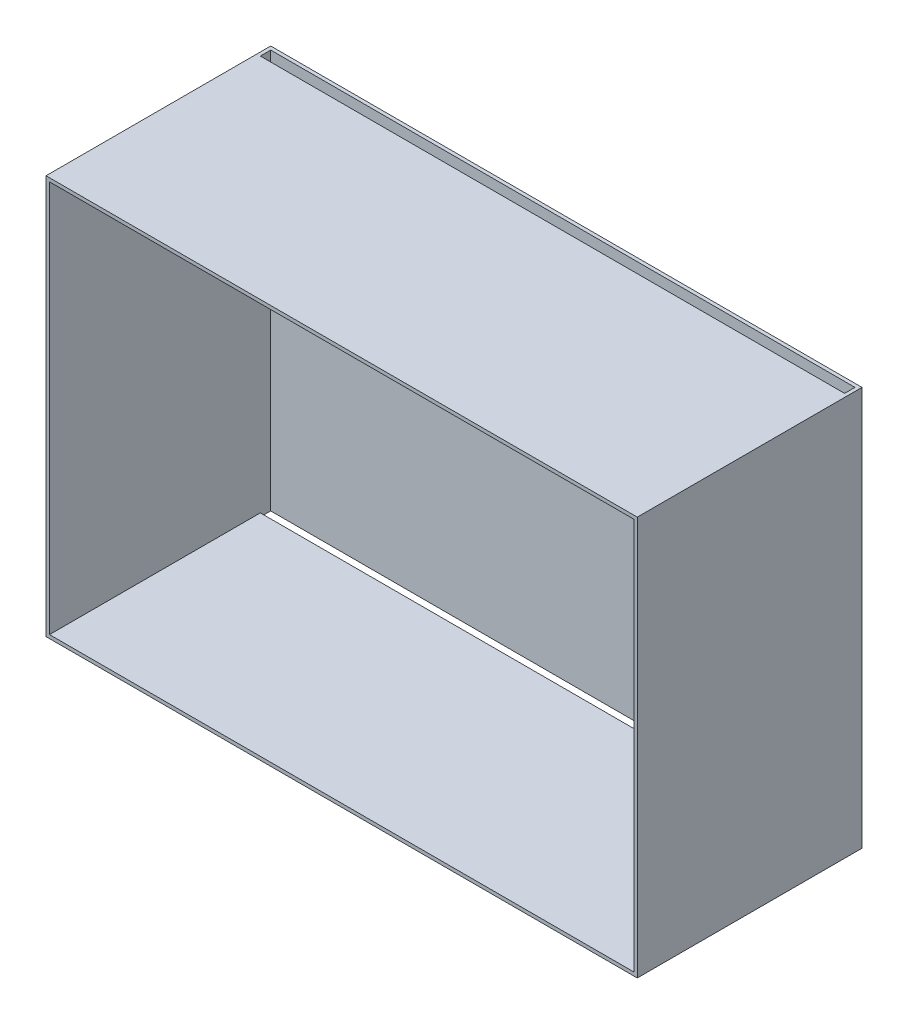
ISO-10303-21;
HEADER;
FILE_DESCRIPTION(('STEP AP214'),'2;1');
FILE_NAME('part.step','',(''),(''),'','','');
FILE_SCHEMA(('AUTOMOTIVE_DESIGN { 1 0 10303 214 1 1 1 1 }'));
ENDSEC;
DATA;
#1=APPLICATION_CONTEXT('core data for automotive mechanical design processes');
#2=APPLICATION_PROTOCOL_DEFINITION('international standard','automotive_design',2000,#1);
#3=PRODUCT_CONTEXT('',#1,'mechanical');
#4=PRODUCT('Part','Part','',(#3));
#5=PRODUCT_RELATED_PRODUCT_CATEGORY('part','',(#4));
#6=PRODUCT_DEFINITION_FORMATION('','',#4);
#7=PRODUCT_DEFINITION_CONTEXT('part definition',#1,'design');
#8=PRODUCT_DEFINITION('design','',#6,#7);
#9=PRODUCT_DEFINITION_SHAPE('','',#8);
#10=(LENGTH_UNIT() NAMED_UNIT(*) SI_UNIT(.MILLI.,.METRE.));
#11=(NAMED_UNIT(*) PLANE_ANGLE_UNIT() SI_UNIT($,.RADIAN.));
#12=(NAMED_UNIT(*) SI_UNIT($,.STERADIAN.) SOLID_ANGLE_UNIT());
#13=UNCERTAINTY_MEASURE_WITH_UNIT(LENGTH_MEASURE(1.E-05),#10,'distance_accuracy_value','');
#14=(GEOMETRIC_REPRESENTATION_CONTEXT(3) GLOBAL_UNCERTAINTY_ASSIGNED_CONTEXT((#13)) GLOBAL_UNIT_ASSIGNED_CONTEXT((#10,
#11,#12)) REPRESENTATION_CONTEXT('',''));
#15=CARTESIAN_POINT('',(0.,0.,0.));
#16=DIRECTION('',(0.,0.,1.));
#17=DIRECTION('',(1.,0.,0.));
#18=AXIS2_PLACEMENT_3D('',#15,#16,#17);
#19=CARTESIAN_POINT('',(0.,-180.467,203.2));
#20=DIRECTION('',(0.,1.,0.));
#21=DIRECTION('',(-1.,0.,0.));
#22=AXIS2_PLACEMENT_3D('',#19,#20,#21);
#23=PLANE('',#22);
#24=DIRECTION('',(1.,0.,0.));
#25=VECTOR('',#24,1.);
#26=CARTESIAN_POINT('',(0.,-180.467,0.));
#27=LINE('',#26,#25);
#28=CARTESIAN_POINT('',(-267.335,-180.467,0.));
#29=VERTEX_POINT('',#28);
#30=CARTESIAN_POINT('',(267.335,-180.467,0.));
#31=VERTEX_POINT('',#30);
#32=EDGE_CURVE('E315',#29,#31,#27,.T.);
#33=ORIENTED_EDGE('',*,*,#32,.T.);
#34=DIRECTION('',(0.,0.,-1.));
#35=VECTOR('',#34,1.);
#36=CARTESIAN_POINT('',(267.335,-180.467,203.2));
#37=LINE('',#36,#35);
#38=CARTESIAN_POINT('',(267.335,-180.467,203.2));
#39=VERTEX_POINT('',#38);
#40=EDGE_CURVE('E324',#39,#31,#37,.T.);
#41=ORIENTED_EDGE('',*,*,#40,.F.);
#42=DIRECTION('',(1.,0.,0.));
#43=VECTOR('',#42,1.);
#44=CARTESIAN_POINT('',(0.,-180.467,203.2));
#45=LINE('',#44,#43);
#46=CARTESIAN_POINT('',(-267.335,-180.467,203.2));
#47=VERTEX_POINT('',#46);
#48=EDGE_CURVE('E301',#47,#39,#45,.T.);
#49=ORIENTED_EDGE('',*,*,#48,.F.);
#50=DIRECTION('',(0.,0.,-1.));
#51=VECTOR('',#50,1.);
#52=CARTESIAN_POINT('',(-267.335,-180.467,203.2));
#53=LINE('',#52,#51);
#54=EDGE_CURVE('E327',#47,#29,#53,.T.);
#55=ORIENTED_EDGE('',*,*,#54,.T.);
#56=EDGE_LOOP('',(#33,#41,#49,#55));
#57=FACE_BOUND('',#56,.T.);
#58=DIRECTION('',(0.,0.,-1.));
#59=VECTOR('',#58,1.);
#60=CARTESIAN_POINT('',(264.16,-180.467,0.));
#61=LINE('',#60,#59);
#62=CARTESIAN_POINT('',(264.16,-180.467,12.573));
#63=VERTEX_POINT('',#62);
#64=CARTESIAN_POINT('',(264.16,-180.467,3.175));
#65=VERTEX_POINT('',#64);
#66=EDGE_CURVE('E133',#63,#65,#61,.T.);
#67=ORIENTED_EDGE('',*,*,#66,.T.);
#68=DIRECTION('',(1.,0.,0.));
#69=VECTOR('',#68,1.);
#70=CARTESIAN_POINT('',(0.,-180.467,3.175));
#71=LINE('',#70,#69);
#72=CARTESIAN_POINT('',(-264.16,-180.467,3.175));
#73=VERTEX_POINT('',#72);
#74=EDGE_CURVE('E231',#73,#65,#71,.T.);
#75=ORIENTED_EDGE('',*,*,#74,.F.);
#76=DIRECTION('',(0.,0.,-1.));
#77=VECTOR('',#76,1.);
#78=CARTESIAN_POINT('',(-264.16,-180.467,0.));
#79=LINE('',#78,#77);
#80=CARTESIAN_POINT('',(-264.16,-180.467,12.573));
#81=VERTEX_POINT('',#80);
#82=EDGE_CURVE('E235',#81,#73,#79,.T.);
#83=ORIENTED_EDGE('',*,*,#82,.F.);
#84=DIRECTION('',(1.,0.,0.));
#85=VECTOR('',#84,1.);
#86=CARTESIAN_POINT('',(0.,-180.467,12.573));
#87=LINE('',#86,#85);
#88=EDGE_CURVE('E244',#81,#63,#87,.T.);
#89=ORIENTED_EDGE('',*,*,#88,.T.);
#90=EDGE_LOOP('',(#67,#75,#83,#89));
#91=FACE_BOUND('',#90,.T.);
#92=ADVANCED_FACE('F117',(#57,#91),#23,.F.);
#93=CARTESIAN_POINT('',(0.,180.467,203.2));
#94=DIRECTION('',(0.,1.,0.));
#95=DIRECTION('',(0.,0.,1.));
#96=AXIS2_PLACEMENT_3D('',#93,#94,#95);
#97=PLANE('',#96);
#98=DIRECTION('',(1.,0.,0.));
#99=VECTOR('',#98,1.);
#100=CARTESIAN_POINT('',(0.,180.467,0.));
#101=LINE('',#100,#99);
#102=CARTESIAN_POINT('',(-267.335,180.467,0.));
#103=VERTEX_POINT('',#102);
#104=CARTESIAN_POINT('',(267.335,180.467,0.));
#105=VERTEX_POINT('',#104);
#106=EDGE_CURVE('E273',#103,#105,#101,.T.);
#107=ORIENTED_EDGE('',*,*,#106,.F.);
#108=DIRECTION('',(0.,0.,-1.));
#109=VECTOR('',#108,1.);
#110=CARTESIAN_POINT('',(-267.335,180.467,203.2));
#111=LINE('',#110,#109);
#112=CARTESIAN_POINT('',(-267.335,180.467,203.2));
#113=VERTEX_POINT('',#112);
#114=EDGE_CURVE('E126',#113,#103,#111,.T.);
#115=ORIENTED_EDGE('',*,*,#114,.F.);
#116=DIRECTION('',(1.,0.,0.));
#117=VECTOR('',#116,1.);
#118=CARTESIAN_POINT('',(0.,180.467,203.2));
#119=LINE('',#118,#117);
#120=CARTESIAN_POINT('',(267.335,180.467,203.2));
#121=VERTEX_POINT('',#120);
#122=EDGE_CURVE('E293',#113,#121,#119,.T.);
#123=ORIENTED_EDGE('',*,*,#122,.T.);
#124=DIRECTION('',(0.,0.,-1.));
#125=VECTOR('',#124,1.);
#126=CARTESIAN_POINT('',(267.335,180.467,203.2));
#127=LINE('',#126,#125);
#128=EDGE_CURVE('E308',#121,#105,#127,.T.);
#129=ORIENTED_EDGE('',*,*,#128,.T.);
#130=EDGE_LOOP('',(#107,#115,#123,#129));
#131=FACE_BOUND('',#130,.T.);
#132=DIRECTION('',(1.,0.,0.));
#133=VECTOR('',#132,1.);
#134=CARTESIAN_POINT('',(0.,180.467,3.175));
#135=LINE('',#134,#133);
#136=CARTESIAN_POINT('',(-264.16,180.467,3.175));
#137=VERTEX_POINT('',#136);
#138=CARTESIAN_POINT('',(264.16,180.467,3.175));
#139=VERTEX_POINT('',#138);
#140=EDGE_CURVE('E229',#137,#139,#135,.T.);
#141=ORIENTED_EDGE('',*,*,#140,.T.);
#142=DIRECTION('',(0.,0.,-1.));
#143=VECTOR('',#142,1.);
#144=CARTESIAN_POINT('',(264.16,180.467,0.));
#145=LINE('',#144,#143);
#146=CARTESIAN_POINT('',(264.16,180.467,12.573));
#147=VERTEX_POINT('',#146);
#148=EDGE_CURVE('E216',#147,#139,#145,.T.);
#149=ORIENTED_EDGE('',*,*,#148,.F.);
#150=DIRECTION('',(1.,0.,0.));
#151=VECTOR('',#150,1.);
#152=CARTESIAN_POINT('',(0.,180.467,12.573));
#153=LINE('',#152,#151);
#154=CARTESIAN_POINT('',(-264.16,180.467,12.573));
#155=VERTEX_POINT('',#154);
#156=EDGE_CURVE('E207',#155,#147,#153,.T.);
#157=ORIENTED_EDGE('',*,*,#156,.F.);
#158=DIRECTION('',(0.,0.,-1.));
#159=VECTOR('',#158,1.);
#160=CARTESIAN_POINT('',(-264.16,180.467,0.));
#161=LINE('',#160,#159);
#162=EDGE_CURVE('E141',#155,#137,#161,.T.);
#163=ORIENTED_EDGE('',*,*,#162,.T.);
#164=EDGE_LOOP('',(#141,#149,#157,#163));
#165=FACE_BOUND('',#164,.T.);
#166=ADVANCED_FACE('F119',(#131,#165),#97,.T.);
#167=CARTESIAN_POINT('',(0.,-177.292,203.2));
#168=DIRECTION('',(0.,1.,0.));
#169=DIRECTION('',(-1.,0.,0.));
#170=AXIS2_PLACEMENT_3D('',#167,#168,#169);
#171=PLANE('',#170);
#172=DIRECTION('',(0.,0.,-1.));
#173=VECTOR('',#172,1.);
#174=CARTESIAN_POINT('',(264.16,-177.292,203.2));
#175=LINE('',#174,#173);
#176=CARTESIAN_POINT('',(264.16,-177.292,203.2));
#177=VERTEX_POINT('',#176);
#178=CARTESIAN_POINT('',(264.16,-177.292,12.573));
#179=VERTEX_POINT('',#178);
#180=EDGE_CURVE('E269',#177,#179,#175,.T.);
#181=ORIENTED_EDGE('',*,*,#180,.T.);
#182=DIRECTION('',(-1.,0.,0.));
#183=VECTOR('',#182,1.);
#184=CARTESIAN_POINT('',(0.,-177.292,12.573));
#185=LINE('',#184,#183);
#186=CARTESIAN_POINT('',(-264.16,-177.292,12.573));
#187=VERTEX_POINT('',#186);
#188=EDGE_CURVE('E252',#179,#187,#185,.T.);
#189=ORIENTED_EDGE('',*,*,#188,.T.);
#190=DIRECTION('',(0.,0.,-1.));
#191=VECTOR('',#190,1.);
#192=CARTESIAN_POINT('',(-264.16,-177.292,203.2));
#193=LINE('',#192,#191);
#194=CARTESIAN_POINT('',(-264.16,-177.292,203.2));
#195=VERTEX_POINT('',#194);
#196=EDGE_CURVE('E264',#195,#187,#193,.T.);
#197=ORIENTED_EDGE('',*,*,#196,.F.);
#198=DIRECTION('',(1.,0.,0.));
#199=VECTOR('',#198,1.);
#200=CARTESIAN_POINT('',(0.,-177.292,203.2));
#201=LINE('',#200,#199);
#202=EDGE_CURVE('E283',#195,#177,#201,.T.);
#203=ORIENTED_EDGE('',*,*,#202,.T.);
#204=EDGE_LOOP('',(#181,#189,#197,#203));
#205=FACE_BOUND('',#204,.T.);
#206=ADVANCED_FACE('F362',(#205),#171,.T.);
#207=CARTESIAN_POINT('',(0.,177.292,203.2));
#208=DIRECTION('',(0.,1.,0.));
#209=DIRECTION('',(0.,0.,1.));
#210=AXIS2_PLACEMENT_3D('',#207,#208,#209);
#211=PLANE('',#210);
#212=DIRECTION('',(-1.,0.,0.));
#213=VECTOR('',#212,1.);
#214=CARTESIAN_POINT('',(0.,177.292,12.573));
#215=LINE('',#214,#213);
#216=CARTESIAN_POINT('',(264.16,177.292,12.573));
#217=VERTEX_POINT('',#216);
#218=CARTESIAN_POINT('',(-264.16,177.292,12.573));
#219=VERTEX_POINT('',#218);
#220=EDGE_CURVE('E12',#217,#219,#215,.T.);
#221=ORIENTED_EDGE('',*,*,#220,.F.);
#222=DIRECTION('',(0.,0.,-1.));
#223=VECTOR('',#222,1.);
#224=CARTESIAN_POINT('',(264.16,177.292,203.2));
#225=LINE('',#224,#223);
#226=CARTESIAN_POINT('',(264.16,177.292,203.2));
#227=VERTEX_POINT('',#226);
#228=EDGE_CURVE('E223',#227,#217,#225,.T.);
#229=ORIENTED_EDGE('',*,*,#228,.F.);
#230=DIRECTION('',(1.,0.,0.));
#231=VECTOR('',#230,1.);
#232=CARTESIAN_POINT('',(0.,177.292,203.2));
#233=LINE('',#232,#231);
#234=CARTESIAN_POINT('',(-264.16,177.292,203.2));
#235=VERTEX_POINT('',#234);
#236=EDGE_CURVE('E261',#235,#227,#233,.T.);
#237=ORIENTED_EDGE('',*,*,#236,.F.);
#238=DIRECTION('',(0.,0.,-1.));
#239=VECTOR('',#238,1.);
#240=CARTESIAN_POINT('',(-264.16,177.292,203.2));
#241=LINE('',#240,#239);
#242=EDGE_CURVE('E268',#235,#219,#241,.T.);
#243=ORIENTED_EDGE('',*,*,#242,.T.);
#244=EDGE_LOOP('',(#221,#229,#237,#243));
#245=FACE_BOUND('',#244,.T.);
#246=ADVANCED_FACE('F354',(#245),#211,.F.);
#247=CARTESIAN_POINT('',(0.,0.,203.2));
#248=DIRECTION('',(0.,0.,1.));
#249=DIRECTION('',(1.,0.,0.));
#250=AXIS2_PLACEMENT_3D('',#247,#248,#249);
#251=PLANE('',#250);
#252=ORIENTED_EDGE('',*,*,#122,.F.);
#253=DIRECTION('',(0.,-1.,0.));
#254=VECTOR('',#253,1.);
#255=CARTESIAN_POINT('',(-267.335,0.,203.2));
#256=LINE('',#255,#254);
#257=EDGE_CURVE('E297',#113,#47,#256,.T.);
#258=ORIENTED_EDGE('',*,*,#257,.T.);
#259=ORIENTED_EDGE('',*,*,#48,.T.);
#260=DIRECTION('',(0.,-1.,0.));
#261=VECTOR('',#260,1.);
#262=CARTESIAN_POINT('',(267.335,0.,203.2));
#263=LINE('',#262,#261);
#264=EDGE_CURVE('E304',#121,#39,#263,.T.);
#265=ORIENTED_EDGE('',*,*,#264,.F.);
#266=EDGE_LOOP('',(#252,#258,#259,#265));
#267=FACE_BOUND('',#266,.T.);
#268=DIRECTION('',(0.,-1.,0.));
#269=VECTOR('',#268,1.);
#270=CARTESIAN_POINT('',(-264.16,0.,203.2));
#271=LINE('',#270,#269);
#272=EDGE_CURVE('E280',#235,#195,#271,.T.);
#273=ORIENTED_EDGE('',*,*,#272,.F.);
#274=ORIENTED_EDGE('',*,*,#236,.T.);
#275=DIRECTION('',(0.,-1.,0.));
#276=VECTOR('',#275,1.);
#277=CARTESIAN_POINT('',(264.16,0.,203.2));
#278=LINE('',#277,#276);
#279=EDGE_CURVE('E279',#227,#177,#278,.T.);
#280=ORIENTED_EDGE('',*,*,#279,.T.);
#281=ORIENTED_EDGE('',*,*,#202,.F.);
#282=EDGE_LOOP('',(#273,#274,#280,#281));
#283=FACE_BOUND('',#282,.T.);
#284=ADVANCED_FACE('F351',(#267,#283),#251,.T.);
#285=CARTESIAN_POINT('',(0.,0.,0.));
#286=DIRECTION('',(0.,0.,1.));
#287=DIRECTION('',(1.,0.,0.));
#288=AXIS2_PLACEMENT_3D('',#285,#286,#287);
#289=PLANE('',#288);
#290=ORIENTED_EDGE('',*,*,#106,.T.);
#291=DIRECTION('',(0.,-1.,0.));
#292=VECTOR('',#291,1.);
#293=CARTESIAN_POINT('',(267.335,0.,0.));
#294=LINE('',#293,#292);
#295=EDGE_CURVE('E298',#105,#31,#294,.T.);
#296=ORIENTED_EDGE('',*,*,#295,.T.);
#297=ORIENTED_EDGE('',*,*,#32,.F.);
#298=DIRECTION('',(0.,-1.,0.));
#299=VECTOR('',#298,1.);
#300=CARTESIAN_POINT('',(-267.335,0.,0.));
#301=LINE('',#300,#299);
#302=EDGE_CURVE('E312',#103,#29,#301,.T.);
#303=ORIENTED_EDGE('',*,*,#302,.F.);
#304=EDGE_LOOP('',(#290,#296,#297,#303));
#305=FACE_BOUND('',#304,.T.);
#306=ADVANCED_FACE('F341',(#305),#289,.F.);
#307=CARTESIAN_POINT('',(-267.335,0.,203.2));
#308=DIRECTION('',(1.,0.,0.));
#309=DIRECTION('',(0.,1.,0.));
#310=AXIS2_PLACEMENT_3D('',#307,#308,#309);
#311=PLANE('',#310);
#312=ORIENTED_EDGE('',*,*,#302,.T.);
#313=ORIENTED_EDGE('',*,*,#54,.F.);
#314=ORIENTED_EDGE('',*,*,#257,.F.);
#315=ORIENTED_EDGE('',*,*,#114,.T.);
#316=EDGE_LOOP('',(#312,#313,#314,#315));
#317=FACE_BOUND('',#316,.T.);
#318=ADVANCED_FACE('F334',(#317),#311,.F.);
#319=CARTESIAN_POINT('',(267.335,0.,203.2));
#320=DIRECTION('',(1.,0.,0.));
#321=DIRECTION('',(0.,1.,0.));
#322=AXIS2_PLACEMENT_3D('',#319,#320,#321);
#323=PLANE('',#322);
#324=ORIENTED_EDGE('',*,*,#295,.F.);
#325=ORIENTED_EDGE('',*,*,#128,.F.);
#326=ORIENTED_EDGE('',*,*,#264,.T.);
#327=ORIENTED_EDGE('',*,*,#40,.T.);
#328=EDGE_LOOP('',(#324,#325,#326,#327));
#329=FACE_BOUND('',#328,.T.);
#330=ADVANCED_FACE('F345',(#329),#323,.T.);
#331=CARTESIAN_POINT('',(0.,0.,3.175));
#332=DIRECTION('',(0.,0.,1.));
#333=DIRECTION('',(1.,0.,0.));
#334=AXIS2_PLACEMENT_3D('',#331,#332,#333);
#335=PLANE('',#334);
#336=DIRECTION('',(0.,-1.,0.));
#337=VECTOR('',#336,1.);
#338=CARTESIAN_POINT('',(264.16,0.,3.17500000000001));
#339=LINE('',#338,#337);
#340=EDGE_CURVE('E258',#139,#65,#339,.T.);
#341=ORIENTED_EDGE('',*,*,#340,.F.);
#342=ORIENTED_EDGE('',*,*,#140,.F.);
#343=DIRECTION('',(0.,-1.,0.));
#344=VECTOR('',#343,1.);
#345=CARTESIAN_POINT('',(-264.16,0.,3.17500000000001));
#346=LINE('',#345,#344);
#347=EDGE_CURVE('E257',#137,#73,#346,.T.);
#348=ORIENTED_EDGE('',*,*,#347,.T.);
#349=ORIENTED_EDGE('',*,*,#74,.T.);
#350=EDGE_LOOP('',(#341,#342,#348,#349));
#351=FACE_BOUND('',#350,.T.);
#352=ADVANCED_FACE('F371',(#351),#335,.T.);
#353=CARTESIAN_POINT('',(-264.16,0.,203.2));
#354=DIRECTION('',(1.,0.,0.));
#355=DIRECTION('',(0.,1.,0.));
#356=AXIS2_PLACEMENT_3D('',#353,#354,#355);
#357=PLANE('',#356);
#358=DIRECTION('',(0.,-1.,0.));
#359=VECTOR('',#358,1.);
#360=CARTESIAN_POINT('',(-264.16,180.467,12.573));
#361=LINE('',#360,#359);
#362=EDGE_CURVE('E212',#155,#219,#361,.T.);
#363=ORIENTED_EDGE('',*,*,#362,.T.);
#364=ORIENTED_EDGE('',*,*,#242,.F.);
#365=ORIENTED_EDGE('',*,*,#272,.T.);
#366=ORIENTED_EDGE('',*,*,#196,.T.);
#367=EDGE_CURVE('E225',#187,#81,#361,.T.);
#368=ORIENTED_EDGE('',*,*,#367,.T.);
#369=ORIENTED_EDGE('',*,*,#82,.T.);
#370=ORIENTED_EDGE('',*,*,#347,.F.);
#371=ORIENTED_EDGE('',*,*,#162,.F.);
#372=EDGE_LOOP('',(#363,#364,#365,#366,#368,#369,#370,#371));
#373=FACE_BOUND('',#372,.T.);
#374=ADVANCED_FACE('F360',(#373),#357,.T.);
#375=CARTESIAN_POINT('',(264.16,0.,203.2));
#376=DIRECTION('',(1.,0.,0.));
#377=DIRECTION('',(0.,1.,0.));
#378=AXIS2_PLACEMENT_3D('',#375,#376,#377);
#379=PLANE('',#378);
#380=ORIENTED_EDGE('',*,*,#340,.T.);
#381=ORIENTED_EDGE('',*,*,#66,.F.);
#382=DIRECTION('',(0.,-1.,0.));
#383=VECTOR('',#382,1.);
#384=CARTESIAN_POINT('',(264.16,180.467,12.573));
#385=LINE('',#384,#383);
#386=EDGE_CURVE('E226',#179,#63,#385,.T.);
#387=ORIENTED_EDGE('',*,*,#386,.F.);
#388=ORIENTED_EDGE('',*,*,#180,.F.);
#389=ORIENTED_EDGE('',*,*,#279,.F.);
#390=ORIENTED_EDGE('',*,*,#228,.T.);
#391=EDGE_CURVE('E210',#147,#217,#385,.T.);
#392=ORIENTED_EDGE('',*,*,#391,.F.);
#393=ORIENTED_EDGE('',*,*,#148,.T.);
#394=EDGE_LOOP('',(#380,#381,#387,#388,#389,#390,#392,#393));
#395=FACE_BOUND('',#394,.T.);
#396=ADVANCED_FACE('F220',(#395),#379,.F.);
#397=CARTESIAN_POINT('',(0.,180.467,12.573));
#398=DIRECTION('',(0.,0.,-1.));
#399=DIRECTION('',(-1.,0.,0.));
#400=AXIS2_PLACEMENT_3D('',#397,#398,#399);
#401=PLANE('',#400);
#402=ORIENTED_EDGE('',*,*,#220,.T.);
#403=ORIENTED_EDGE('',*,*,#362,.F.);
#404=ORIENTED_EDGE('',*,*,#156,.T.);
#405=ORIENTED_EDGE('',*,*,#391,.T.);
#406=EDGE_LOOP('',(#402,#403,#404,#405));
#407=FACE_BOUND('',#406,.T.);
#408=ADVANCED_FACE('F209',(#407),#401,.T.);
#409=ORIENTED_EDGE('',*,*,#386,.T.);
#410=ORIENTED_EDGE('',*,*,#88,.F.);
#411=ORIENTED_EDGE('',*,*,#367,.F.);
#412=ORIENTED_EDGE('',*,*,#188,.F.);
#413=EDGE_LOOP('',(#409,#410,#411,#412));
#414=FACE_BOUND('',#413,.T.);
#415=ADVANCED_FACE('F364',(#414),#401,.T.);
#416=CLOSED_SHELL('',(#92,#166,#206,#246,#284,#306,#318,#330,#352,#374,#396,#408,#415));
#417=MANIFOLD_SOLID_BREP('B2',#416);
#418=ADVANCED_BREP_SHAPE_REPRESENTATION('',(#18,#417),#14);
#419=SHAPE_DEFINITION_REPRESENTATION(#9,#418);
ENDSEC;
END-ISO-10303-21;
